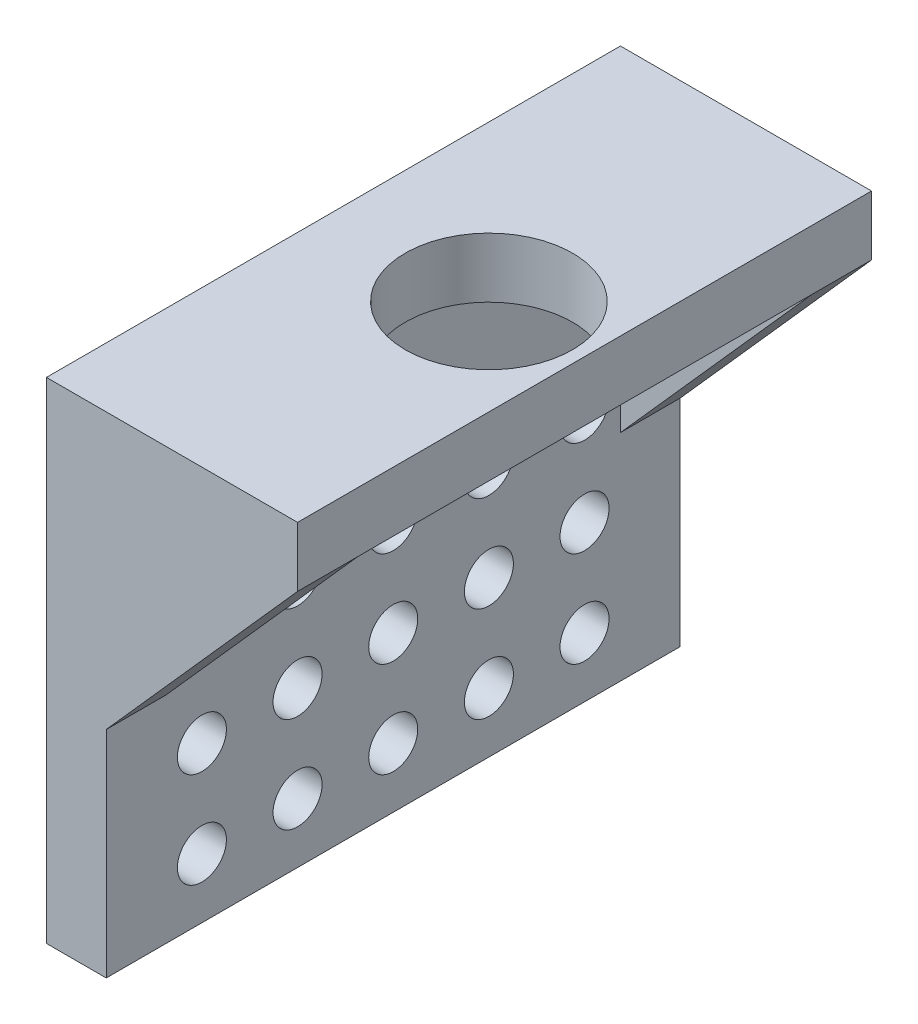
ISO-10303-21;
HEADER;
FILE_DESCRIPTION(('STEP AP214'),'2;1');
FILE_NAME('part.step','',(''),(''),'','','');
FILE_SCHEMA(('AUTOMOTIVE_DESIGN { 1 0 10303 214 1 1 1 1 }'));
ENDSEC;
DATA;
#1=APPLICATION_CONTEXT('core data for automotive mechanical design processes');
#2=APPLICATION_PROTOCOL_DEFINITION('international standard','automotive_design',2000,#1);
#3=PRODUCT_CONTEXT('',#1,'mechanical');
#4=PRODUCT('Part','Part','',(#3));
#5=PRODUCT_RELATED_PRODUCT_CATEGORY('part','',(#4));
#6=PRODUCT_DEFINITION_FORMATION('','',#4);
#7=PRODUCT_DEFINITION_CONTEXT('part definition',#1,'design');
#8=PRODUCT_DEFINITION('design','',#6,#7);
#9=PRODUCT_DEFINITION_SHAPE('','',#8);
#10=(LENGTH_UNIT() NAMED_UNIT(*) SI_UNIT(.MILLI.,.METRE.));
#11=(NAMED_UNIT(*) PLANE_ANGLE_UNIT() SI_UNIT($,.RADIAN.));
#12=(NAMED_UNIT(*) SI_UNIT($,.STERADIAN.) SOLID_ANGLE_UNIT());
#13=UNCERTAINTY_MEASURE_WITH_UNIT(LENGTH_MEASURE(1.E-05),#10,'distance_accuracy_value','');
#14=(GEOMETRIC_REPRESENTATION_CONTEXT(3) GLOBAL_UNCERTAINTY_ASSIGNED_CONTEXT((#13)) GLOBAL_UNIT_ASSIGNED_CONTEXT((#10,
#11,#12)) REPRESENTATION_CONTEXT('',''));
#15=CARTESIAN_POINT('',(0.,0.,0.));
#16=DIRECTION('',(0.,0.,1.));
#17=DIRECTION('',(1.,0.,0.));
#18=AXIS2_PLACEMENT_3D('',#15,#16,#17);
#19=CARTESIAN_POINT('',(0.,0.,0.));
#20=DIRECTION('',(0.,-1.,0.));
#21=DIRECTION('',(0.,0.,-1.));
#22=AXIS2_PLACEMENT_3D('',#19,#20,#21);
#23=PLANE('',#22);
#24=CARTESIAN_POINT('',(13.,0.,24.));
#25=DIRECTION('',(0.,1.,0.));
#26=DIRECTION('',(0.,0.,1.));
#27=AXIS2_PLACEMENT_3D('',#24,#25,#26);
#28=CIRCLE('',#27,7.);
#29=CARTESIAN_POINT('',(13.,0.,31.));
#30=VERTEX_POINT('',#29);
#31=EDGE_CURVE('E164',#30,#30,#28,.T.);
#32=ORIENTED_EDGE('',*,*,#31,.T.);
#33=EDGE_LOOP('',(#32));
#34=FACE_BOUND('',#33,.T.);
#35=DIRECTION('',(0.,0.,1.));
#36=VECTOR('',#35,1.);
#37=CARTESIAN_POINT('',(5.,0.,48.));
#38=LINE('',#37,#36);
#39=CARTESIAN_POINT('',(5.,0.,5.));
#40=VERTEX_POINT('',#39);
#41=CARTESIAN_POINT('',(5.,0.,43.));
#42=VERTEX_POINT('',#41);
#43=EDGE_CURVE('E63',#40,#42,#38,.T.);
#44=ORIENTED_EDGE('',*,*,#43,.F.);
#45=DIRECTION('',(-1.,0.,0.));
#46=VECTOR('',#45,1.);
#47=CARTESIAN_POINT('',(21.,0.,5.));
#48=LINE('',#47,#46);
#49=CARTESIAN_POINT('',(21.,0.,5.));
#50=VERTEX_POINT('',#49);
#51=EDGE_CURVE('E208',#50,#40,#48,.T.);
#52=ORIENTED_EDGE('',*,*,#51,.F.);
#53=DIRECTION('',(0.,0.,-1.));
#54=VECTOR('',#53,1.);
#55=CARTESIAN_POINT('',(21.,0.,0.));
#56=LINE('',#55,#54);
#57=CARTESIAN_POINT('',(21.,0.,43.));
#58=VERTEX_POINT('',#57);
#59=EDGE_CURVE('E135',#58,#50,#56,.T.);
#60=ORIENTED_EDGE('',*,*,#59,.F.);
#61=DIRECTION('',(1.,0.,0.));
#62=VECTOR('',#61,1.);
#63=CARTESIAN_POINT('',(21.,0.,43.));
#64=LINE('',#63,#62);
#65=EDGE_CURVE('E199',#42,#58,#64,.T.);
#66=ORIENTED_EDGE('',*,*,#65,.F.);
#67=EDGE_LOOP('',(#44,#52,#60,#66));
#68=FACE_BOUND('',#67,.T.);
#69=ADVANCED_FACE('F39',(#34,#68),#23,.T.);
#70=CARTESIAN_POINT('',(5.,-36.,48.));
#71=DIRECTION('',(-1.,0.,0.));
#72=DIRECTION('',(0.,0.,1.));
#73=AXIS2_PLACEMENT_3D('',#70,#71,#72);
#74=PLANE('',#73);
#75=CARTESIAN_POINT('',(5.00000000000001,-31.,16.));
#76=DIRECTION('',(-1.,0.,0.));
#77=DIRECTION('',(0.,0.,1.));
#78=AXIS2_PLACEMENT_3D('',#75,#76,#77);
#79=CIRCLE('',#78,2.05);
#80=CARTESIAN_POINT('',(5.00000000000001,-31.,18.05));
#81=VERTEX_POINT('',#80);
#82=EDGE_CURVE('E220',#81,#81,#79,.T.);
#83=ORIENTED_EDGE('',*,*,#82,.T.);
#84=EDGE_LOOP('',(#83));
#85=FACE_BOUND('',#84,.T.);
#86=CARTESIAN_POINT('',(5.,-31.,24.));
#87=DIRECTION('',(-1.,0.,0.));
#88=DIRECTION('',(0.,0.,1.));
#89=AXIS2_PLACEMENT_3D('',#86,#87,#88);
#90=CIRCLE('',#89,2.05);
#91=CARTESIAN_POINT('',(5.,-31.,26.05));
#92=VERTEX_POINT('',#91);
#93=EDGE_CURVE('E225',#92,#92,#90,.T.);
#94=ORIENTED_EDGE('',*,*,#93,.T.);
#95=EDGE_LOOP('',(#94));
#96=FACE_BOUND('',#95,.T.);
#97=CARTESIAN_POINT('',(5.,-31.,32.));
#98=DIRECTION('',(-1.,0.,0.));
#99=DIRECTION('',(0.,0.,1.));
#100=AXIS2_PLACEMENT_3D('',#97,#98,#99);
#101=CIRCLE('',#100,2.05);
#102=CARTESIAN_POINT('',(5.,-31.,34.05));
#103=VERTEX_POINT('',#102);
#104=EDGE_CURVE('E229',#103,#103,#101,.T.);
#105=ORIENTED_EDGE('',*,*,#104,.T.);
#106=EDGE_LOOP('',(#105));
#107=FACE_BOUND('',#106,.T.);
#108=CARTESIAN_POINT('',(5.,-31.,40.));
#109=DIRECTION('',(-1.,0.,0.));
#110=DIRECTION('',(0.,0.,1.));
#111=AXIS2_PLACEMENT_3D('',#108,#109,#110);
#112=CIRCLE('',#111,2.05);
#113=CARTESIAN_POINT('',(5.,-31.,42.05));
#114=VERTEX_POINT('',#113);
#115=EDGE_CURVE('E233',#114,#114,#112,.T.);
#116=ORIENTED_EDGE('',*,*,#115,.T.);
#117=EDGE_LOOP('',(#116));
#118=FACE_BOUND('',#117,.T.);
#119=CARTESIAN_POINT('',(5.00000000000001,-23.,16.));
#120=DIRECTION('',(-1.,0.,0.));
#121=DIRECTION('',(0.,0.,1.));
#122=AXIS2_PLACEMENT_3D('',#119,#120,#121);
#123=CIRCLE('',#122,2.05);
#124=CARTESIAN_POINT('',(5.00000000000001,-23.,18.05));
#125=VERTEX_POINT('',#124);
#126=EDGE_CURVE('E237',#125,#125,#123,.T.);
#127=ORIENTED_EDGE('',*,*,#126,.T.);
#128=EDGE_LOOP('',(#127));
#129=FACE_BOUND('',#128,.T.);
#130=CARTESIAN_POINT('',(5.,-23.,24.));
#131=DIRECTION('',(-1.,0.,0.));
#132=DIRECTION('',(0.,0.,1.));
#133=AXIS2_PLACEMENT_3D('',#130,#131,#132);
#134=CIRCLE('',#133,2.05);
#135=CARTESIAN_POINT('',(5.,-23.,26.05));
#136=VERTEX_POINT('',#135);
#137=EDGE_CURVE('E241',#136,#136,#134,.T.);
#138=ORIENTED_EDGE('',*,*,#137,.T.);
#139=EDGE_LOOP('',(#138));
#140=FACE_BOUND('',#139,.T.);
#141=CARTESIAN_POINT('',(5.,-23.,32.));
#142=DIRECTION('',(-1.,0.,0.));
#143=DIRECTION('',(0.,0.,1.));
#144=AXIS2_PLACEMENT_3D('',#141,#142,#143);
#145=CIRCLE('',#144,2.05);
#146=CARTESIAN_POINT('',(5.,-23.,34.05));
#147=VERTEX_POINT('',#146);
#148=EDGE_CURVE('E245',#147,#147,#145,.T.);
#149=ORIENTED_EDGE('',*,*,#148,.T.);
#150=EDGE_LOOP('',(#149));
#151=FACE_BOUND('',#150,.T.);
#152=CARTESIAN_POINT('',(5.,-23.,40.));
#153=DIRECTION('',(-1.,0.,0.));
#154=DIRECTION('',(0.,0.,1.));
#155=AXIS2_PLACEMENT_3D('',#152,#153,#154);
#156=CIRCLE('',#155,2.05);
#157=CARTESIAN_POINT('',(5.,-23.,42.05));
#158=VERTEX_POINT('',#157);
#159=EDGE_CURVE('E249',#158,#158,#156,.T.);
#160=ORIENTED_EDGE('',*,*,#159,.T.);
#161=EDGE_LOOP('',(#160));
#162=FACE_BOUND('',#161,.T.);
#163=CARTESIAN_POINT('',(5.00000000000001,-15.,16.));
#164=DIRECTION('',(-1.,0.,0.));
#165=DIRECTION('',(0.,0.,1.));
#166=AXIS2_PLACEMENT_3D('',#163,#164,#165);
#167=CIRCLE('',#166,2.05);
#168=CARTESIAN_POINT('',(5.00000000000001,-15.,18.05));
#169=VERTEX_POINT('',#168);
#170=EDGE_CURVE('E253',#169,#169,#167,.T.);
#171=ORIENTED_EDGE('',*,*,#170,.T.);
#172=EDGE_LOOP('',(#171));
#173=FACE_BOUND('',#172,.T.);
#174=CARTESIAN_POINT('',(5.,-15.,24.));
#175=DIRECTION('',(-1.,0.,0.));
#176=DIRECTION('',(0.,0.,1.));
#177=AXIS2_PLACEMENT_3D('',#174,#175,#176);
#178=CIRCLE('',#177,2.05);
#179=CARTESIAN_POINT('',(5.,-15.,26.05));
#180=VERTEX_POINT('',#179);
#181=EDGE_CURVE('E257',#180,#180,#178,.T.);
#182=ORIENTED_EDGE('',*,*,#181,.T.);
#183=EDGE_LOOP('',(#182));
#184=FACE_BOUND('',#183,.T.);
#185=CARTESIAN_POINT('',(5.,-15.,32.));
#186=DIRECTION('',(-1.,0.,0.));
#187=DIRECTION('',(0.,0.,1.));
#188=AXIS2_PLACEMENT_3D('',#185,#186,#187);
#189=CIRCLE('',#188,2.05);
#190=CARTESIAN_POINT('',(5.,-15.,34.05));
#191=VERTEX_POINT('',#190);
#192=EDGE_CURVE('E261',#191,#191,#189,.T.);
#193=ORIENTED_EDGE('',*,*,#192,.T.);
#194=EDGE_LOOP('',(#193));
#195=FACE_BOUND('',#194,.T.);
#196=CARTESIAN_POINT('',(5.,-15.,40.));
#197=DIRECTION('',(-1.,0.,0.));
#198=DIRECTION('',(0.,0.,1.));
#199=AXIS2_PLACEMENT_3D('',#196,#197,#198);
#200=CIRCLE('',#199,2.05);
#201=CARTESIAN_POINT('',(5.,-15.,42.05));
#202=VERTEX_POINT('',#201);
#203=EDGE_CURVE('E265',#202,#202,#200,.T.);
#204=ORIENTED_EDGE('',*,*,#203,.T.);
#205=EDGE_LOOP('',(#204));
#206=FACE_BOUND('',#205,.T.);
#207=CARTESIAN_POINT('',(5.00000000000001,-23.,7.99999999999998));
#208=DIRECTION('',(-1.,0.,0.));
#209=DIRECTION('',(0.,0.,1.));
#210=AXIS2_PLACEMENT_3D('',#207,#208,#209);
#211=CIRCLE('',#210,2.05);
#212=CARTESIAN_POINT('',(5.00000000000001,-23.,10.05));
#213=VERTEX_POINT('',#212);
#214=EDGE_CURVE('E269',#213,#213,#211,.T.);
#215=ORIENTED_EDGE('',*,*,#214,.T.);
#216=EDGE_LOOP('',(#215));
#217=FACE_BOUND('',#216,.T.);
#218=CARTESIAN_POINT('',(5.00000000000001,-15.,7.99999999999995));
#219=DIRECTION('',(-1.,0.,0.));
#220=DIRECTION('',(0.,0.,1.));
#221=AXIS2_PLACEMENT_3D('',#218,#219,#220);
#222=CIRCLE('',#221,2.05);
#223=CARTESIAN_POINT('',(5.00000000000001,-15.,10.05));
#224=VERTEX_POINT('',#223);
#225=EDGE_CURVE('E273',#224,#224,#222,.T.);
#226=ORIENTED_EDGE('',*,*,#225,.T.);
#227=EDGE_LOOP('',(#226));
#228=FACE_BOUND('',#227,.T.);
#229=CARTESIAN_POINT('',(5.00000000000001,-31.,8.00000000000001));
#230=DIRECTION('',(-1.,0.,0.));
#231=DIRECTION('',(0.,0.,1.));
#232=AXIS2_PLACEMENT_3D('',#229,#230,#231);
#233=CIRCLE('',#232,2.05);
#234=CARTESIAN_POINT('',(5.00000000000001,-31.,10.05));
#235=VERTEX_POINT('',#234);
#236=EDGE_CURVE('E277',#235,#235,#233,.T.);
#237=ORIENTED_EDGE('',*,*,#236,.T.);
#238=EDGE_LOOP('',(#237));
#239=FACE_BOUND('',#238,.T.);
#240=DIRECTION('',(0.,1.,0.));
#241=VECTOR('',#240,1.);
#242=CARTESIAN_POINT('',(5.,-18.,43.));
#243=LINE('',#242,#241);
#244=CARTESIAN_POINT('',(5.,-18.,43.));
#245=VERTEX_POINT('',#244);
#246=EDGE_CURVE('E182',#245,#42,#243,.T.);
#247=ORIENTED_EDGE('',*,*,#246,.F.);
#248=DIRECTION('',(0.,0.,-1.));
#249=VECTOR('',#248,1.);
#250=CARTESIAN_POINT('',(5.,-18.,43.));
#251=LINE('',#250,#249);
#252=CARTESIAN_POINT('',(5.,-18.,48.));
#253=VERTEX_POINT('',#252);
#254=EDGE_CURVE('E198',#253,#245,#251,.T.);
#255=ORIENTED_EDGE('',*,*,#254,.F.);
#256=DIRECTION('',(0.,1.,0.));
#257=VECTOR('',#256,1.);
#258=CARTESIAN_POINT('',(5.,-36.,48.));
#259=LINE('',#258,#257);
#260=CARTESIAN_POINT('',(5.,-36.,48.));
#261=VERTEX_POINT('',#260);
#262=EDGE_CURVE('E174',#261,#253,#259,.T.);
#263=ORIENTED_EDGE('',*,*,#262,.F.);
#264=DIRECTION('',(0.,0.,1.));
#265=VECTOR('',#264,1.);
#266=CARTESIAN_POINT('',(5.,-36.,48.));
#267=LINE('',#266,#265);
#268=CARTESIAN_POINT('',(5.00000000000001,-36.,0.));
#269=VERTEX_POINT('',#268);
#270=EDGE_CURVE('E186',#269,#261,#267,.T.);
#271=ORIENTED_EDGE('',*,*,#270,.F.);
#272=DIRECTION('',(0.,1.,0.));
#273=VECTOR('',#272,1.);
#274=CARTESIAN_POINT('',(5.00000000000001,-36.,0.));
#275=LINE('',#274,#273);
#276=CARTESIAN_POINT('',(5.,-18.,0.));
#277=VERTEX_POINT('',#276);
#278=EDGE_CURVE('E168',#269,#277,#275,.T.);
#279=ORIENTED_EDGE('',*,*,#278,.T.);
#280=DIRECTION('',(0.,0.,-1.));
#281=VECTOR('',#280,1.);
#282=CARTESIAN_POINT('',(5.,-18.,5.));
#283=LINE('',#282,#281);
#284=CARTESIAN_POINT('',(5.,-18.,5.));
#285=VERTEX_POINT('',#284);
#286=EDGE_CURVE('E117',#285,#277,#283,.T.);
#287=ORIENTED_EDGE('',*,*,#286,.F.);
#288=DIRECTION('',(0.,1.,0.));
#289=VECTOR('',#288,1.);
#290=CARTESIAN_POINT('',(5.,-18.,5.));
#291=LINE('',#290,#289);
#292=EDGE_CURVE('E203',#285,#40,#291,.T.);
#293=ORIENTED_EDGE('',*,*,#292,.T.);
#294=ORIENTED_EDGE('',*,*,#43,.T.);
#295=EDGE_LOOP('',(#247,#255,#263,#271,#279,#287,#293,#294));
#296=FACE_BOUND('',#295,.T.);
#297=ADVANCED_FACE('F380',(#85,#96,#107,#118,#129,#140,#151,#162,#173,#184,#195,#206,#217,#228,
#239,#296),#74,.F.);
#298=CARTESIAN_POINT('',(0.,5.,0.));
#299=DIRECTION('',(0.,-1.,0.));
#300=DIRECTION('',(0.,0.,-1.));
#301=AXIS2_PLACEMENT_3D('',#298,#299,#300);
#302=PLANE('',#301);
#303=DIRECTION('',(0.,0.,1.));
#304=VECTOR('',#303,1.);
#305=CARTESIAN_POINT('',(0.,5.,48.));
#306=LINE('',#305,#304);
#307=CARTESIAN_POINT('',(0.,5.,0.));
#308=VERTEX_POINT('',#307);
#309=CARTESIAN_POINT('',(0.,5.,48.));
#310=VERTEX_POINT('',#309);
#311=EDGE_CURVE('E151',#308,#310,#306,.T.);
#312=ORIENTED_EDGE('',*,*,#311,.T.);
#313=DIRECTION('',(1.,0.,0.));
#314=VECTOR('',#313,1.);
#315=CARTESIAN_POINT('',(21.,5.,48.));
#316=LINE('',#315,#314);
#317=CARTESIAN_POINT('',(21.,5.,48.));
#318=VERTEX_POINT('',#317);
#319=EDGE_CURVE('E158',#310,#318,#316,.T.);
#320=ORIENTED_EDGE('',*,*,#319,.T.);
#321=DIRECTION('',(0.,0.,-1.));
#322=VECTOR('',#321,1.);
#323=CARTESIAN_POINT('',(21.,5.,0.));
#324=LINE('',#323,#322);
#325=CARTESIAN_POINT('',(21.,5.,0.));
#326=VERTEX_POINT('',#325);
#327=EDGE_CURVE('E155',#318,#326,#324,.T.);
#328=ORIENTED_EDGE('',*,*,#327,.T.);
#329=DIRECTION('',(-1.,0.,0.));
#330=VECTOR('',#329,1.);
#331=CARTESIAN_POINT('',(0.,5.,0.));
#332=LINE('',#331,#330);
#333=EDGE_CURVE('E141',#326,#308,#332,.T.);
#334=ORIENTED_EDGE('',*,*,#333,.T.);
#335=EDGE_LOOP('',(#312,#320,#328,#334));
#336=FACE_BOUND('',#335,.T.);
#337=CARTESIAN_POINT('',(13.,5.,24.));
#338=DIRECTION('',(0.,1.,0.));
#339=DIRECTION('',(0.,0.,1.));
#340=AXIS2_PLACEMENT_3D('',#337,#338,#339);
#341=CIRCLE('',#340,7.);
#342=CARTESIAN_POINT('',(13.,5.,31.));
#343=VERTEX_POINT('',#342);
#344=EDGE_CURVE('E152',#343,#343,#341,.T.);
#345=ORIENTED_EDGE('',*,*,#344,.F.);
#346=EDGE_LOOP('',(#345));
#347=FACE_BOUND('',#346,.T.);
#348=ADVANCED_FACE('F348',(#336,#347),#302,.F.);
#349=CARTESIAN_POINT('',(0.,5.,48.));
#350=DIRECTION('',(1.,0.,0.));
#351=DIRECTION('',(0.,0.,-1.));
#352=AXIS2_PLACEMENT_3D('',#349,#350,#351);
#353=PLANE('',#352);
#354=CARTESIAN_POINT('',(0.,-31.,16.));
#355=DIRECTION('',(-1.,0.,0.));
#356=DIRECTION('',(0.,0.,1.));
#357=AXIS2_PLACEMENT_3D('',#354,#355,#356);
#358=CIRCLE('',#357,2.05);
#359=CARTESIAN_POINT('',(0.,-31.,18.05));
#360=VERTEX_POINT('',#359);
#361=EDGE_CURVE('E285',#360,#360,#358,.T.);
#362=ORIENTED_EDGE('',*,*,#361,.F.);
#363=EDGE_LOOP('',(#362));
#364=FACE_BOUND('',#363,.T.);
#365=CARTESIAN_POINT('',(0.,-31.,24.));
#366=DIRECTION('',(-1.,0.,0.));
#367=DIRECTION('',(0.,0.,1.));
#368=AXIS2_PLACEMENT_3D('',#365,#366,#367);
#369=CIRCLE('',#368,2.05);
#370=CARTESIAN_POINT('',(0.,-31.,26.05));
#371=VERTEX_POINT('',#370);
#372=EDGE_CURVE('E311',#371,#371,#369,.T.);
#373=ORIENTED_EDGE('',*,*,#372,.F.);
#374=EDGE_LOOP('',(#373));
#375=FACE_BOUND('',#374,.T.);
#376=CARTESIAN_POINT('',(0.,-31.,32.));
#377=DIRECTION('',(-1.,0.,0.));
#378=DIRECTION('',(0.,0.,1.));
#379=AXIS2_PLACEMENT_3D('',#376,#377,#378);
#380=CIRCLE('',#379,2.05);
#381=CARTESIAN_POINT('',(0.,-31.,34.05));
#382=VERTEX_POINT('',#381);
#383=EDGE_CURVE('E307',#382,#382,#380,.T.);
#384=ORIENTED_EDGE('',*,*,#383,.F.);
#385=EDGE_LOOP('',(#384));
#386=FACE_BOUND('',#385,.T.);
#387=CARTESIAN_POINT('',(0.,-31.,40.));
#388=DIRECTION('',(-1.,0.,0.));
#389=DIRECTION('',(0.,0.,1.));
#390=AXIS2_PLACEMENT_3D('',#387,#388,#389);
#391=CIRCLE('',#390,2.05);
#392=CARTESIAN_POINT('',(0.,-31.,42.05));
#393=VERTEX_POINT('',#392);
#394=EDGE_CURVE('E303',#393,#393,#391,.T.);
#395=ORIENTED_EDGE('',*,*,#394,.F.);
#396=EDGE_LOOP('',(#395));
#397=FACE_BOUND('',#396,.T.);
#398=CARTESIAN_POINT('',(0.,-23.,16.));
#399=DIRECTION('',(-1.,0.,0.));
#400=DIRECTION('',(0.,0.,1.));
#401=AXIS2_PLACEMENT_3D('',#398,#399,#400);
#402=CIRCLE('',#401,2.05);
#403=CARTESIAN_POINT('',(0.,-23.,18.05));
#404=VERTEX_POINT('',#403);
#405=EDGE_CURVE('E299',#404,#404,#402,.T.);
#406=ORIENTED_EDGE('',*,*,#405,.F.);
#407=EDGE_LOOP('',(#406));
#408=FACE_BOUND('',#407,.T.);
#409=CARTESIAN_POINT('',(0.,-23.,24.));
#410=DIRECTION('',(-1.,0.,0.));
#411=DIRECTION('',(0.,0.,1.));
#412=AXIS2_PLACEMENT_3D('',#409,#410,#411);
#413=CIRCLE('',#412,2.05);
#414=CARTESIAN_POINT('',(0.,-23.,26.05));
#415=VERTEX_POINT('',#414);
#416=EDGE_CURVE('E295',#415,#415,#413,.T.);
#417=ORIENTED_EDGE('',*,*,#416,.F.);
#418=EDGE_LOOP('',(#417));
#419=FACE_BOUND('',#418,.T.);
#420=CARTESIAN_POINT('',(0.,-23.,32.));
#421=DIRECTION('',(-1.,0.,0.));
#422=DIRECTION('',(0.,0.,1.));
#423=AXIS2_PLACEMENT_3D('',#420,#421,#422);
#424=CIRCLE('',#423,2.05);
#425=CARTESIAN_POINT('',(0.,-23.,34.05));
#426=VERTEX_POINT('',#425);
#427=EDGE_CURVE('E290',#426,#426,#424,.T.);
#428=ORIENTED_EDGE('',*,*,#427,.F.);
#429=EDGE_LOOP('',(#428));
#430=FACE_BOUND('',#429,.T.);
#431=CARTESIAN_POINT('',(0.,-23.,40.));
#432=DIRECTION('',(-1.,0.,0.));
#433=DIRECTION('',(0.,0.,1.));
#434=AXIS2_PLACEMENT_3D('',#431,#432,#433);
#435=CIRCLE('',#434,2.05);
#436=CARTESIAN_POINT('',(0.,-23.,42.05));
#437=VERTEX_POINT('',#436);
#438=EDGE_CURVE('E286',#437,#437,#435,.T.);
#439=ORIENTED_EDGE('',*,*,#438,.F.);
#440=EDGE_LOOP('',(#439));
#441=FACE_BOUND('',#440,.T.);
#442=CARTESIAN_POINT('',(0.,-15.,16.));
#443=DIRECTION('',(-1.,0.,0.));
#444=DIRECTION('',(0.,0.,1.));
#445=AXIS2_PLACEMENT_3D('',#442,#443,#444);
#446=CIRCLE('',#445,2.05);
#447=CARTESIAN_POINT('',(0.,-15.,18.05));
#448=VERTEX_POINT('',#447);
#449=EDGE_CURVE('E291',#448,#448,#446,.T.);
#450=ORIENTED_EDGE('',*,*,#449,.F.);
#451=EDGE_LOOP('',(#450));
#452=FACE_BOUND('',#451,.T.);
#453=CARTESIAN_POINT('',(0.,-15.,24.));
#454=DIRECTION('',(-1.,0.,0.));
#455=DIRECTION('',(0.,0.,1.));
#456=AXIS2_PLACEMENT_3D('',#453,#454,#455);
#457=CIRCLE('',#456,2.05);
#458=CARTESIAN_POINT('',(0.,-15.,26.05));
#459=VERTEX_POINT('',#458);
#460=EDGE_CURVE('E334',#459,#459,#457,.T.);
#461=ORIENTED_EDGE('',*,*,#460,.F.);
#462=EDGE_LOOP('',(#461));
#463=FACE_BOUND('',#462,.T.);
#464=CARTESIAN_POINT('',(0.,-15.,32.));
#465=DIRECTION('',(-1.,0.,0.));
#466=DIRECTION('',(0.,0.,1.));
#467=AXIS2_PLACEMENT_3D('',#464,#465,#466);
#468=CIRCLE('',#467,2.05);
#469=CARTESIAN_POINT('',(0.,-15.,34.05));
#470=VERTEX_POINT('',#469);
#471=EDGE_CURVE('E330',#470,#470,#468,.T.);
#472=ORIENTED_EDGE('',*,*,#471,.F.);
#473=EDGE_LOOP('',(#472));
#474=FACE_BOUND('',#473,.T.);
#475=CARTESIAN_POINT('',(0.,-15.,40.));
#476=DIRECTION('',(-1.,0.,0.));
#477=DIRECTION('',(0.,0.,1.));
#478=AXIS2_PLACEMENT_3D('',#475,#476,#477);
#479=CIRCLE('',#478,2.05);
#480=CARTESIAN_POINT('',(0.,-15.,42.05));
#481=VERTEX_POINT('',#480);
#482=EDGE_CURVE('E326',#481,#481,#479,.T.);
#483=ORIENTED_EDGE('',*,*,#482,.F.);
#484=EDGE_LOOP('',(#483));
#485=FACE_BOUND('',#484,.T.);
#486=CARTESIAN_POINT('',(0.,-23.,7.99999999999998));
#487=DIRECTION('',(-1.,0.,0.));
#488=DIRECTION('',(0.,0.,1.));
#489=AXIS2_PLACEMENT_3D('',#486,#487,#488);
#490=CIRCLE('',#489,2.05);
#491=CARTESIAN_POINT('',(0.,-23.,10.05));
#492=VERTEX_POINT('',#491);
#493=EDGE_CURVE('E322',#492,#492,#490,.T.);
#494=ORIENTED_EDGE('',*,*,#493,.F.);
#495=EDGE_LOOP('',(#494));
#496=FACE_BOUND('',#495,.T.);
#497=CARTESIAN_POINT('',(0.,-15.,7.99999999999995));
#498=DIRECTION('',(-1.,0.,0.));
#499=DIRECTION('',(0.,0.,1.));
#500=AXIS2_PLACEMENT_3D('',#497,#498,#499);
#501=CIRCLE('',#500,2.05);
#502=CARTESIAN_POINT('',(0.,-15.,10.05));
#503=VERTEX_POINT('',#502);
#504=EDGE_CURVE('E318',#503,#503,#501,.T.);
#505=ORIENTED_EDGE('',*,*,#504,.F.);
#506=EDGE_LOOP('',(#505));
#507=FACE_BOUND('',#506,.T.);
#508=CARTESIAN_POINT('',(0.,-31.,8.00000000000001));
#509=DIRECTION('',(-1.,0.,0.));
#510=DIRECTION('',(0.,0.,1.));
#511=AXIS2_PLACEMENT_3D('',#508,#509,#510);
#512=CIRCLE('',#511,2.05);
#513=CARTESIAN_POINT('',(0.,-31.,10.05));
#514=VERTEX_POINT('',#513);
#515=EDGE_CURVE('E281',#514,#514,#512,.T.);
#516=ORIENTED_EDGE('',*,*,#515,.F.);
#517=EDGE_LOOP('',(#516));
#518=FACE_BOUND('',#517,.T.);
#519=DIRECTION('',(0.,-1.,0.));
#520=VECTOR('',#519,1.);
#521=CARTESIAN_POINT('',(0.,5.,0.));
#522=LINE('',#521,#520);
#523=CARTESIAN_POINT('',(0.,-36.,0.));
#524=VERTEX_POINT('',#523);
#525=EDGE_CURVE('E143',#308,#524,#522,.T.);
#526=ORIENTED_EDGE('',*,*,#525,.T.);
#527=DIRECTION('',(0.,0.,-1.));
#528=VECTOR('',#527,1.);
#529=CARTESIAN_POINT('',(0.,-36.,0.));
#530=LINE('',#529,#528);
#531=CARTESIAN_POINT('',(0.,-36.,48.));
#532=VERTEX_POINT('',#531);
#533=EDGE_CURVE('E181',#532,#524,#530,.T.);
#534=ORIENTED_EDGE('',*,*,#533,.F.);
#535=DIRECTION('',(0.,-1.,0.));
#536=VECTOR('',#535,1.);
#537=CARTESIAN_POINT('',(0.,5.,48.));
#538=LINE('',#537,#536);
#539=EDGE_CURVE('E11',#310,#532,#538,.T.);
#540=ORIENTED_EDGE('',*,*,#539,.F.);
#541=ORIENTED_EDGE('',*,*,#311,.F.);
#542=EDGE_LOOP('',(#526,#534,#540,#541));
#543=FACE_BOUND('',#542,.T.);
#544=ADVANCED_FACE('F41',(#364,#375,#386,#397,#408,#419,#430,#441,#452,#463,#474,#485,#496,#507,
#518,#543),#353,.F.);
#545=CARTESIAN_POINT('',(21.,5.,48.));
#546=DIRECTION('',(0.,0.,-1.));
#547=DIRECTION('',(-1.,0.,0.));
#548=AXIS2_PLACEMENT_3D('',#545,#546,#547);
#549=PLANE('',#548);
#550=ORIENTED_EDGE('',*,*,#262,.T.);
#551=DIRECTION('',(-0.66436383882992,-0.747409318683659,0.));
#552=VECTOR('',#551,1.);
#553=CARTESIAN_POINT('',(21.,0.,48.));
#554=LINE('',#553,#552);
#555=CARTESIAN_POINT('',(21.,0.,48.));
#556=VERTEX_POINT('',#555);
#557=EDGE_CURVE('E55',#556,#253,#554,.T.);
#558=ORIENTED_EDGE('',*,*,#557,.F.);
#559=DIRECTION('',(0.,-1.,0.));
#560=VECTOR('',#559,1.);
#561=CARTESIAN_POINT('',(21.,5.,48.));
#562=LINE('',#561,#560);
#563=EDGE_CURVE('E48',#318,#556,#562,.T.);
#564=ORIENTED_EDGE('',*,*,#563,.F.);
#565=ORIENTED_EDGE('',*,*,#319,.F.);
#566=ORIENTED_EDGE('',*,*,#539,.T.);
#567=DIRECTION('',(-1.,0.,0.));
#568=VECTOR('',#567,1.);
#569=CARTESIAN_POINT('',(0.,-36.,48.));
#570=LINE('',#569,#568);
#571=EDGE_CURVE('E178',#261,#532,#570,.T.);
#572=ORIENTED_EDGE('',*,*,#571,.F.);
#573=EDGE_LOOP('',(#550,#558,#564,#565,#566,#572));
#574=FACE_BOUND('',#573,.T.);
#575=ADVANCED_FACE('F347',(#574),#549,.F.);
#576=CARTESIAN_POINT('',(21.,5.,0.));
#577=DIRECTION('',(-1.,0.,0.));
#578=DIRECTION('',(0.,0.,1.));
#579=AXIS2_PLACEMENT_3D('',#576,#577,#578);
#580=PLANE('',#579);
#581=ORIENTED_EDGE('',*,*,#563,.T.);
#582=DIRECTION('',(0.,0.,1.));
#583=VECTOR('',#582,1.);
#584=CARTESIAN_POINT('',(21.,0.,0.));
#585=LINE('',#584,#583);
#586=EDGE_CURVE('E123',#58,#556,#585,.T.);
#587=ORIENTED_EDGE('',*,*,#586,.F.);
#588=ORIENTED_EDGE('',*,*,#59,.T.);
#589=CARTESIAN_POINT('',(21.,0.,0.));
#590=VERTEX_POINT('',#589);
#591=EDGE_CURVE('E114',#590,#50,#585,.T.);
#592=ORIENTED_EDGE('',*,*,#591,.F.);
#593=DIRECTION('',(0.,-1.,0.));
#594=VECTOR('',#593,1.);
#595=CARTESIAN_POINT('',(21.,5.,0.));
#596=LINE('',#595,#594);
#597=EDGE_CURVE('E131',#326,#590,#596,.T.);
#598=ORIENTED_EDGE('',*,*,#597,.F.);
#599=ORIENTED_EDGE('',*,*,#327,.F.);
#600=EDGE_LOOP('',(#581,#587,#588,#592,#598,#599));
#601=FACE_BOUND('',#600,.T.);
#602=ADVANCED_FACE('F129',(#601),#580,.F.);
#603=CARTESIAN_POINT('',(0.,5.,0.));
#604=DIRECTION('',(0.,0.,1.));
#605=DIRECTION('',(1.,0.,0.));
#606=AXIS2_PLACEMENT_3D('',#603,#604,#605);
#607=PLANE('',#606);
#608=ORIENTED_EDGE('',*,*,#597,.T.);
#609=DIRECTION('',(-0.66436383882992,-0.747409318683659,0.));
#610=VECTOR('',#609,1.);
#611=CARTESIAN_POINT('',(21.,0.,0.));
#612=LINE('',#611,#610);
#613=EDGE_CURVE('E111',#590,#277,#612,.T.);
#614=ORIENTED_EDGE('',*,*,#613,.T.);
#615=ORIENTED_EDGE('',*,*,#278,.F.);
#616=DIRECTION('',(1.,0.,0.));
#617=VECTOR('',#616,1.);
#618=CARTESIAN_POINT('',(5.00000000000001,-36.,0.));
#619=LINE('',#618,#617);
#620=EDGE_CURVE('E189',#524,#269,#619,.T.);
#621=ORIENTED_EDGE('',*,*,#620,.F.);
#622=ORIENTED_EDGE('',*,*,#525,.F.);
#623=ORIENTED_EDGE('',*,*,#333,.F.);
#624=EDGE_LOOP('',(#608,#614,#615,#621,#622,#623));
#625=FACE_BOUND('',#624,.T.);
#626=ADVANCED_FACE('F139',(#625),#607,.F.);
#627=CARTESIAN_POINT('',(13.,5.,24.));
#628=DIRECTION('',(0.,-1.,0.));
#629=DIRECTION('',(0.,0.,-1.));
#630=AXIS2_PLACEMENT_3D('',#627,#628,#629);
#631=CYLINDRICAL_SURFACE('',#630,7.);
#632=ORIENTED_EDGE('',*,*,#344,.T.);
#633=EDGE_LOOP('',(#632));
#634=FACE_BOUND('',#633,.T.);
#635=ORIENTED_EDGE('',*,*,#31,.F.);
#636=EDGE_LOOP('',(#635));
#637=FACE_BOUND('',#636,.T.);
#638=ADVANCED_FACE('F407',(#634,#637),#631,.F.);
#639=CARTESIAN_POINT('',(0.,-36.,0.));
#640=DIRECTION('',(0.,1.,0.));
#641=DIRECTION('',(0.,0.,1.));
#642=AXIS2_PLACEMENT_3D('',#639,#640,#641);
#643=PLANE('',#642);
#644=ORIENTED_EDGE('',*,*,#533,.T.);
#645=ORIENTED_EDGE('',*,*,#620,.T.);
#646=ORIENTED_EDGE('',*,*,#270,.T.);
#647=ORIENTED_EDGE('',*,*,#571,.T.);
#648=EDGE_LOOP('',(#644,#645,#646,#647));
#649=FACE_BOUND('',#648,.T.);
#650=ADVANCED_FACE('F368',(#649),#643,.F.);
#651=CARTESIAN_POINT('',(21.,-18.,43.));
#652=DIRECTION('',(0.,0.,1.));
#653=DIRECTION('',(1.,0.,0.));
#654=AXIS2_PLACEMENT_3D('',#651,#652,#653);
#655=PLANE('',#654);
#656=ORIENTED_EDGE('',*,*,#65,.T.);
#657=DIRECTION('',(-0.66436383882992,-0.74740931868366,0.));
#658=VECTOR('',#657,1.);
#659=CARTESIAN_POINT('',(12.0620689655173,-10.0551724137931,43.));
#660=LINE('',#659,#658);
#661=EDGE_CURVE('E211',#58,#245,#660,.T.);
#662=ORIENTED_EDGE('',*,*,#661,.T.);
#663=ORIENTED_EDGE('',*,*,#246,.T.);
#664=EDGE_LOOP('',(#656,#662,#663));
#665=FACE_BOUND('',#664,.T.);
#666=ADVANCED_FACE('F379',(#665),#655,.F.);
#667=CARTESIAN_POINT('',(21.,-18.,5.));
#668=DIRECTION('',(0.,0.,-1.));
#669=DIRECTION('',(-1.,0.,0.));
#670=AXIS2_PLACEMENT_3D('',#667,#668,#669);
#671=PLANE('',#670);
#672=ORIENTED_EDGE('',*,*,#292,.F.);
#673=DIRECTION('',(0.66436383882992,0.74740931868366,0.));
#674=VECTOR('',#673,1.);
#675=CARTESIAN_POINT('',(12.0620689655173,-10.0551724137931,5.));
#676=LINE('',#675,#674);
#677=EDGE_CURVE('E137',#285,#50,#676,.T.);
#678=ORIENTED_EDGE('',*,*,#677,.T.);
#679=ORIENTED_EDGE('',*,*,#51,.T.);
#680=EDGE_LOOP('',(#672,#678,#679));
#681=FACE_BOUND('',#680,.T.);
#682=ADVANCED_FACE('F392',(#681),#671,.F.);
#683=CARTESIAN_POINT('',(21.,0.,0.));
#684=DIRECTION('',(-0.747409318683659,0.66436383882992,0.));
#685=DIRECTION('',(-0.66436383882992,-0.74740931868366,0.));
#686=AXIS2_PLACEMENT_3D('',#683,#684,#685);
#687=PLANE('',#686);
#688=ORIENTED_EDGE('',*,*,#286,.T.);
#689=ORIENTED_EDGE('',*,*,#613,.F.);
#690=ORIENTED_EDGE('',*,*,#591,.T.);
#691=ORIENTED_EDGE('',*,*,#677,.F.);
#692=EDGE_LOOP('',(#688,#689,#690,#691));
#693=FACE_BOUND('',#692,.T.);
#694=ADVANCED_FACE('F113',(#693),#687,.F.);
#695=ORIENTED_EDGE('',*,*,#586,.T.);
#696=ORIENTED_EDGE('',*,*,#557,.T.);
#697=ORIENTED_EDGE('',*,*,#254,.T.);
#698=ORIENTED_EDGE('',*,*,#661,.F.);
#699=EDGE_LOOP('',(#695,#696,#697,#698));
#700=FACE_BOUND('',#699,.T.);
#701=ADVANCED_FACE('F381',(#700),#687,.F.);
#702=CARTESIAN_POINT('',(18.,-31.,8.00000000000001));
#703=DIRECTION('',(-1.,0.,0.));
#704=DIRECTION('',(0.,0.,1.));
#705=AXIS2_PLACEMENT_3D('',#702,#703,#704);
#706=CYLINDRICAL_SURFACE('',#705,2.05);
#707=ORIENTED_EDGE('',*,*,#515,.T.);
#708=EDGE_LOOP('',(#707));
#709=FACE_BOUND('',#708,.T.);
#710=ORIENTED_EDGE('',*,*,#236,.F.);
#711=EDGE_LOOP('',(#710));
#712=FACE_BOUND('',#711,.T.);
#713=ADVANCED_FACE('F383',(#709,#712),#706,.F.);
#714=CARTESIAN_POINT('',(18.,-15.,7.99999999999995));
#715=DIRECTION('',(-1.,0.,0.));
#716=DIRECTION('',(0.,0.,1.));
#717=AXIS2_PLACEMENT_3D('',#714,#715,#716);
#718=CYLINDRICAL_SURFACE('',#717,2.05);
#719=ORIENTED_EDGE('',*,*,#504,.T.);
#720=EDGE_LOOP('',(#719));
#721=FACE_BOUND('',#720,.T.);
#722=ORIENTED_EDGE('',*,*,#225,.F.);
#723=EDGE_LOOP('',(#722));
#724=FACE_BOUND('',#723,.T.);
#725=ADVANCED_FACE('F389',(#721,#724),#718,.F.);
#726=CARTESIAN_POINT('',(18.,-23.,7.99999999999998));
#727=DIRECTION('',(-1.,0.,0.));
#728=DIRECTION('',(0.,0.,1.));
#729=AXIS2_PLACEMENT_3D('',#726,#727,#728);
#730=CYLINDRICAL_SURFACE('',#729,2.05);
#731=ORIENTED_EDGE('',*,*,#493,.T.);
#732=EDGE_LOOP('',(#731));
#733=FACE_BOUND('',#732,.T.);
#734=ORIENTED_EDGE('',*,*,#214,.F.);
#735=EDGE_LOOP('',(#734));
#736=FACE_BOUND('',#735,.T.);
#737=ADVANCED_FACE('F484',(#733,#736),#730,.F.);
#738=CARTESIAN_POINT('',(18.,-15.,40.));
#739=DIRECTION('',(-1.,0.,0.));
#740=DIRECTION('',(0.,0.,1.));
#741=AXIS2_PLACEMENT_3D('',#738,#739,#740);
#742=CYLINDRICAL_SURFACE('',#741,2.05);
#743=ORIENTED_EDGE('',*,*,#482,.T.);
#744=EDGE_LOOP('',(#743));
#745=FACE_BOUND('',#744,.T.);
#746=ORIENTED_EDGE('',*,*,#203,.F.);
#747=EDGE_LOOP('',(#746));
#748=FACE_BOUND('',#747,.T.);
#749=ADVANCED_FACE('F494',(#745,#748),#742,.F.);
#750=CARTESIAN_POINT('',(18.,-15.,32.));
#751=DIRECTION('',(-1.,0.,0.));
#752=DIRECTION('',(0.,0.,1.));
#753=AXIS2_PLACEMENT_3D('',#750,#751,#752);
#754=CYLINDRICAL_SURFACE('',#753,2.05);
#755=ORIENTED_EDGE('',*,*,#471,.T.);
#756=EDGE_LOOP('',(#755));
#757=FACE_BOUND('',#756,.T.);
#758=ORIENTED_EDGE('',*,*,#192,.F.);
#759=EDGE_LOOP('',(#758));
#760=FACE_BOUND('',#759,.T.);
#761=ADVANCED_FACE('F504',(#757,#760),#754,.F.);
#762=CARTESIAN_POINT('',(18.,-15.,24.));
#763=DIRECTION('',(-1.,0.,0.));
#764=DIRECTION('',(0.,0.,1.));
#765=AXIS2_PLACEMENT_3D('',#762,#763,#764);
#766=CYLINDRICAL_SURFACE('',#765,2.05);
#767=ORIENTED_EDGE('',*,*,#460,.T.);
#768=EDGE_LOOP('',(#767));
#769=FACE_BOUND('',#768,.T.);
#770=ORIENTED_EDGE('',*,*,#181,.F.);
#771=EDGE_LOOP('',(#770));
#772=FACE_BOUND('',#771,.T.);
#773=ADVANCED_FACE('F514',(#769,#772),#766,.F.);
#774=CARTESIAN_POINT('',(18.,-15.,16.));
#775=DIRECTION('',(-1.,0.,0.));
#776=DIRECTION('',(0.,0.,1.));
#777=AXIS2_PLACEMENT_3D('',#774,#775,#776);
#778=CYLINDRICAL_SURFACE('',#777,2.05);
#779=ORIENTED_EDGE('',*,*,#449,.T.);
#780=EDGE_LOOP('',(#779));
#781=FACE_BOUND('',#780,.T.);
#782=ORIENTED_EDGE('',*,*,#170,.F.);
#783=EDGE_LOOP('',(#782));
#784=FACE_BOUND('',#783,.T.);
#785=ADVANCED_FACE('F342',(#781,#784),#778,.F.);
#786=CARTESIAN_POINT('',(18.,-23.,40.));
#787=DIRECTION('',(-1.,0.,0.));
#788=DIRECTION('',(0.,0.,1.));
#789=AXIS2_PLACEMENT_3D('',#786,#787,#788);
#790=CYLINDRICAL_SURFACE('',#789,2.05);
#791=ORIENTED_EDGE('',*,*,#438,.T.);
#792=EDGE_LOOP('',(#791));
#793=FACE_BOUND('',#792,.T.);
#794=ORIENTED_EDGE('',*,*,#159,.F.);
#795=EDGE_LOOP('',(#794));
#796=FACE_BOUND('',#795,.T.);
#797=ADVANCED_FACE('F533',(#793,#796),#790,.F.);
#798=CARTESIAN_POINT('',(18.,-23.,32.));
#799=DIRECTION('',(-1.,0.,0.));
#800=DIRECTION('',(0.,0.,1.));
#801=AXIS2_PLACEMENT_3D('',#798,#799,#800);
#802=CYLINDRICAL_SURFACE('',#801,2.05);
#803=ORIENTED_EDGE('',*,*,#427,.T.);
#804=EDGE_LOOP('',(#803));
#805=FACE_BOUND('',#804,.T.);
#806=ORIENTED_EDGE('',*,*,#148,.F.);
#807=EDGE_LOOP('',(#806));
#808=FACE_BOUND('',#807,.T.);
#809=ADVANCED_FACE('F542',(#805,#808),#802,.F.);
#810=CARTESIAN_POINT('',(18.,-23.,24.));
#811=DIRECTION('',(-1.,0.,0.));
#812=DIRECTION('',(0.,0.,1.));
#813=AXIS2_PLACEMENT_3D('',#810,#811,#812);
#814=CYLINDRICAL_SURFACE('',#813,2.05);
#815=ORIENTED_EDGE('',*,*,#416,.T.);
#816=EDGE_LOOP('',(#815));
#817=FACE_BOUND('',#816,.T.);
#818=ORIENTED_EDGE('',*,*,#137,.F.);
#819=EDGE_LOOP('',(#818));
#820=FACE_BOUND('',#819,.T.);
#821=ADVANCED_FACE('F552',(#817,#820),#814,.F.);
#822=CARTESIAN_POINT('',(18.,-23.,16.));
#823=DIRECTION('',(-1.,0.,0.));
#824=DIRECTION('',(0.,0.,1.));
#825=AXIS2_PLACEMENT_3D('',#822,#823,#824);
#826=CYLINDRICAL_SURFACE('',#825,2.05);
#827=ORIENTED_EDGE('',*,*,#405,.T.);
#828=EDGE_LOOP('',(#827));
#829=FACE_BOUND('',#828,.T.);
#830=ORIENTED_EDGE('',*,*,#126,.F.);
#831=EDGE_LOOP('',(#830));
#832=FACE_BOUND('',#831,.T.);
#833=ADVANCED_FACE('F562',(#829,#832),#826,.F.);
#834=CARTESIAN_POINT('',(18.,-31.,40.));
#835=DIRECTION('',(-1.,0.,0.));
#836=DIRECTION('',(0.,0.,1.));
#837=AXIS2_PLACEMENT_3D('',#834,#835,#836);
#838=CYLINDRICAL_SURFACE('',#837,2.05);
#839=ORIENTED_EDGE('',*,*,#394,.T.);
#840=EDGE_LOOP('',(#839));
#841=FACE_BOUND('',#840,.T.);
#842=ORIENTED_EDGE('',*,*,#115,.F.);
#843=EDGE_LOOP('',(#842));
#844=FACE_BOUND('',#843,.T.);
#845=ADVANCED_FACE('F572',(#841,#844),#838,.F.);
#846=CARTESIAN_POINT('',(18.,-31.,32.));
#847=DIRECTION('',(-1.,0.,0.));
#848=DIRECTION('',(0.,0.,1.));
#849=AXIS2_PLACEMENT_3D('',#846,#847,#848);
#850=CYLINDRICAL_SURFACE('',#849,2.05);
#851=ORIENTED_EDGE('',*,*,#383,.T.);
#852=EDGE_LOOP('',(#851));
#853=FACE_BOUND('',#852,.T.);
#854=ORIENTED_EDGE('',*,*,#104,.F.);
#855=EDGE_LOOP('',(#854));
#856=FACE_BOUND('',#855,.T.);
#857=ADVANCED_FACE('F582',(#853,#856),#850,.F.);
#858=CARTESIAN_POINT('',(18.,-31.,24.));
#859=DIRECTION('',(-1.,0.,0.));
#860=DIRECTION('',(0.,0.,1.));
#861=AXIS2_PLACEMENT_3D('',#858,#859,#860);
#862=CYLINDRICAL_SURFACE('',#861,2.05);
#863=ORIENTED_EDGE('',*,*,#372,.T.);
#864=EDGE_LOOP('',(#863));
#865=FACE_BOUND('',#864,.T.);
#866=ORIENTED_EDGE('',*,*,#93,.F.);
#867=EDGE_LOOP('',(#866));
#868=FACE_BOUND('',#867,.T.);
#869=ADVANCED_FACE('F592',(#865,#868),#862,.F.);
#870=CARTESIAN_POINT('',(18.,-31.,16.));
#871=DIRECTION('',(-1.,0.,0.));
#872=DIRECTION('',(0.,0.,1.));
#873=AXIS2_PLACEMENT_3D('',#870,#871,#872);
#874=CYLINDRICAL_SURFACE('',#873,2.05);
#875=ORIENTED_EDGE('',*,*,#361,.T.);
#876=EDGE_LOOP('',(#875));
#877=FACE_BOUND('',#876,.T.);
#878=ORIENTED_EDGE('',*,*,#82,.F.);
#879=EDGE_LOOP('',(#878));
#880=FACE_BOUND('',#879,.T.);
#881=ADVANCED_FACE('F602',(#877,#880),#874,.F.);
#882=CLOSED_SHELL('',(#69,#297,#348,#544,#575,#602,#626,#638,#650,#666,#682,#694,#701,#713,#725,
#737,#749,#761,#773,#785,#797,#809,#821,#833,#845,#857,#869,#881));
#883=MANIFOLD_SOLID_BREP('B2',#882);
#884=ADVANCED_BREP_SHAPE_REPRESENTATION('',(#18,#883),#14);
#885=SHAPE_DEFINITION_REPRESENTATION(#9,#884);
ENDSEC;
END-ISO-10303-21;
